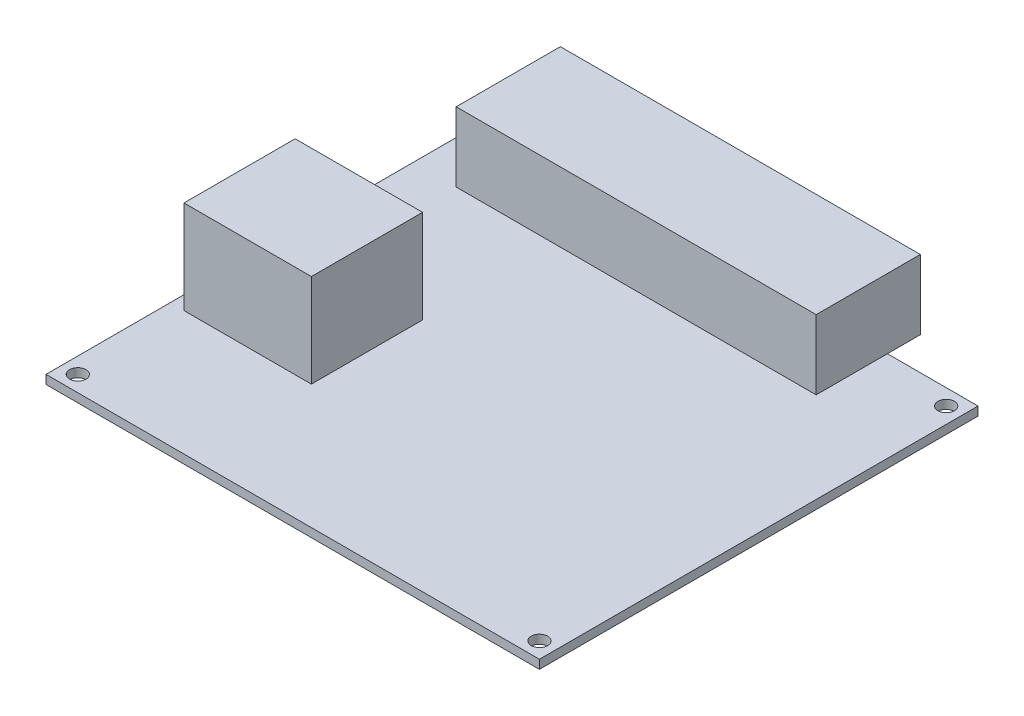
ISO-10303-21;
HEADER;
FILE_DESCRIPTION(('STEP AP214'),'2;1');
FILE_NAME('part.step','',(''),(''),'','','');
FILE_SCHEMA(('AUTOMOTIVE_DESIGN { 1 0 10303 214 1 1 1 1 }'));
ENDSEC;
DATA;
#1=APPLICATION_CONTEXT('core data for automotive mechanical design processes');
#2=APPLICATION_PROTOCOL_DEFINITION('international standard','automotive_design',2000,#1);
#3=PRODUCT_CONTEXT('',#1,'mechanical');
#4=PRODUCT('Part','Part','',(#3));
#5=PRODUCT_RELATED_PRODUCT_CATEGORY('part','',(#4));
#6=PRODUCT_DEFINITION_FORMATION('','',#4);
#7=PRODUCT_DEFINITION_CONTEXT('part definition',#1,'design');
#8=PRODUCT_DEFINITION('design','',#6,#7);
#9=PRODUCT_DEFINITION_SHAPE('','',#8);
#10=(LENGTH_UNIT() NAMED_UNIT(*) SI_UNIT(.MILLI.,.METRE.));
#11=(NAMED_UNIT(*) PLANE_ANGLE_UNIT() SI_UNIT($,.RADIAN.));
#12=(NAMED_UNIT(*) SI_UNIT($,.STERADIAN.) SOLID_ANGLE_UNIT());
#13=UNCERTAINTY_MEASURE_WITH_UNIT(LENGTH_MEASURE(1.E-05),#10,'distance_accuracy_value','');
#14=(GEOMETRIC_REPRESENTATION_CONTEXT(3) GLOBAL_UNCERTAINTY_ASSIGNED_CONTEXT((#13)) GLOBAL_UNIT_ASSIGNED_CONTEXT((#10,
#11,#12)) REPRESENTATION_CONTEXT('',''));
#15=CARTESIAN_POINT('',(0.,0.,0.));
#16=DIRECTION('',(0.,0.,1.));
#17=DIRECTION('',(1.,0.,0.));
#18=AXIS2_PLACEMENT_3D('',#15,#16,#17);
#19=CARTESIAN_POINT('',(0.,1.6,0.));
#20=DIRECTION('',(0.,-1.,0.));
#21=DIRECTION('',(0.,0.,-1.));
#22=AXIS2_PLACEMENT_3D('',#19,#20,#21);
#23=PLANE('',#22);
#24=DIRECTION('',(0.,0.,1.));
#25=VECTOR('',#24,1.);
#26=CARTESIAN_POINT('',(-37.18,1.6,-27.));
#27=LINE('',#26,#25);
#28=CARTESIAN_POINT('',(-37.18,1.6,-40.));
#29=VERTEX_POINT('',#28);
#30=CARTESIAN_POINT('',(-37.18,1.6,-27.));
#31=VERTEX_POINT('',#30);
#32=EDGE_CURVE('E11',#29,#31,#27,.T.);
#33=ORIENTED_EDGE('',*,*,#32,.F.);
#34=DIRECTION('',(-1.,0.,0.));
#35=VECTOR('',#34,1.);
#36=CARTESIAN_POINT('',(-45.,1.6,-40.));
#37=LINE('',#36,#35);
#38=CARTESIAN_POINT('',(-45.,1.6,-40.));
#39=VERTEX_POINT('',#38);
#40=EDGE_CURVE('E253',#29,#39,#37,.T.);
#41=ORIENTED_EDGE('',*,*,#40,.T.);
#42=DIRECTION('',(0.,0.,1.));
#43=VECTOR('',#42,1.);
#44=CARTESIAN_POINT('',(-45.,1.6,40.));
#45=LINE('',#44,#43);
#46=CARTESIAN_POINT('',(-45.,1.6,40.));
#47=VERTEX_POINT('',#46);
#48=EDGE_CURVE('E259',#39,#47,#45,.T.);
#49=ORIENTED_EDGE('',*,*,#48,.T.);
#50=DIRECTION('',(1.,0.,0.));
#51=VECTOR('',#50,1.);
#52=CARTESIAN_POINT('',(-45.,1.6,40.));
#53=LINE('',#52,#51);
#54=CARTESIAN_POINT('',(45.,1.6,40.));
#55=VERTEX_POINT('',#54);
#56=EDGE_CURVE('E263',#47,#55,#53,.T.);
#57=ORIENTED_EDGE('',*,*,#56,.T.);
#58=DIRECTION('',(0.,0.,-1.));
#59=VECTOR('',#58,1.);
#60=CARTESIAN_POINT('',(45.,1.6,40.));
#61=LINE('',#60,#59);
#62=CARTESIAN_POINT('',(45.,1.6,-40.));
#63=VERTEX_POINT('',#62);
#64=EDGE_CURVE('E249',#55,#63,#61,.T.);
#65=ORIENTED_EDGE('',*,*,#64,.T.);
#66=CARTESIAN_POINT('',(28.48,1.6,-40.));
#67=VERTEX_POINT('',#66);
#68=EDGE_CURVE('E255',#63,#67,#37,.T.);
#69=ORIENTED_EDGE('',*,*,#68,.T.);
#70=DIRECTION('',(0.,0.,-1.));
#71=VECTOR('',#70,1.);
#72=CARTESIAN_POINT('',(28.48,1.6,-46.));
#73=LINE('',#72,#71);
#74=CARTESIAN_POINT('',(28.48,1.6,-27.));
#75=VERTEX_POINT('',#74);
#76=EDGE_CURVE('E195',#75,#67,#73,.T.);
#77=ORIENTED_EDGE('',*,*,#76,.F.);
#78=DIRECTION('',(1.,0.,0.));
#79=VECTOR('',#78,1.);
#80=CARTESIAN_POINT('',(28.48,1.6,-27.));
#81=LINE('',#80,#79);
#82=EDGE_CURVE('E171',#31,#75,#81,.T.);
#83=ORIENTED_EDGE('',*,*,#82,.F.);
#84=EDGE_LOOP('',(#33,#41,#49,#57,#65,#69,#77,#83));
#85=FACE_BOUND('',#84,.T.);
#86=CARTESIAN_POINT('',(-42.1,1.6,-37.1));
#87=DIRECTION('',(0.,1.,0.));
#88=DIRECTION('',(0.,0.,1.));
#89=AXIS2_PLACEMENT_3D('',#86,#87,#88);
#90=CIRCLE('',#89,1.5);
#91=CARTESIAN_POINT('',(-42.1,1.6,-35.6));
#92=VERTEX_POINT('',#91);
#93=EDGE_CURVE('E241',#92,#92,#90,.T.);
#94=ORIENTED_EDGE('',*,*,#93,.F.);
#95=EDGE_LOOP('',(#94));
#96=FACE_BOUND('',#95,.T.);
#97=CARTESIAN_POINT('',(42.1,1.6,-37.1));
#98=DIRECTION('',(0.,1.,0.));
#99=DIRECTION('',(0.,0.,-1.));
#100=AXIS2_PLACEMENT_3D('',#97,#98,#99);
#101=CIRCLE('',#100,1.5);
#102=CARTESIAN_POINT('',(42.1,1.6,-38.6));
#103=VERTEX_POINT('',#102);
#104=EDGE_CURVE('E233',#103,#103,#101,.T.);
#105=ORIENTED_EDGE('',*,*,#104,.F.);
#106=EDGE_LOOP('',(#105));
#107=FACE_BOUND('',#106,.T.);
#108=CARTESIAN_POINT('',(-42.1,1.6,37.1));
#109=DIRECTION('',(0.,1.,0.));
#110=DIRECTION('',(0.,0.,-1.));
#111=AXIS2_PLACEMENT_3D('',#108,#109,#110);
#112=CIRCLE('',#111,1.5);
#113=CARTESIAN_POINT('',(-42.1,1.6,35.6));
#114=VERTEX_POINT('',#113);
#115=EDGE_CURVE('E225',#114,#114,#112,.T.);
#116=ORIENTED_EDGE('',*,*,#115,.F.);
#117=EDGE_LOOP('',(#116));
#118=FACE_BOUND('',#117,.T.);
#119=CARTESIAN_POINT('',(42.1,1.6,37.1));
#120=DIRECTION('',(0.,1.,0.));
#121=DIRECTION('',(0.,0.,1.));
#122=AXIS2_PLACEMENT_3D('',#119,#120,#121);
#123=CIRCLE('',#122,1.5);
#124=CARTESIAN_POINT('',(42.1,1.6,38.6));
#125=VERTEX_POINT('',#124);
#126=EDGE_CURVE('E217',#125,#125,#123,.T.);
#127=ORIENTED_EDGE('',*,*,#126,.F.);
#128=EDGE_LOOP('',(#127));
#129=FACE_BOUND('',#128,.T.);
#130=DIRECTION('',(0.,0.,-1.));
#131=VECTOR('',#130,1.);
#132=CARTESIAN_POINT('',(-19.2535187945024,1.6,17.3394270574598));
#133=LINE('',#132,#131);
#134=CARTESIAN_POINT('',(-19.2535187945024,1.6,17.3394270574598));
#135=VERTEX_POINT('',#134);
#136=CARTESIAN_POINT('',(-19.2535187945024,1.6,-2.93942705745984));
#137=VERTEX_POINT('',#136);
#138=EDGE_CURVE('E165',#135,#137,#133,.T.);
#139=ORIENTED_EDGE('',*,*,#138,.F.);
#140=DIRECTION('',(1.,0.,0.));
#141=VECTOR('',#140,1.);
#142=CARTESIAN_POINT('',(-42.494452723961,1.6,17.3394270574598));
#143=LINE('',#142,#141);
#144=CARTESIAN_POINT('',(-42.494452723961,1.6,17.3394270574598));
#145=VERTEX_POINT('',#144);
#146=EDGE_CURVE('E162',#145,#135,#143,.T.);
#147=ORIENTED_EDGE('',*,*,#146,.F.);
#148=DIRECTION('',(0.,0.,1.));
#149=VECTOR('',#148,1.);
#150=CARTESIAN_POINT('',(-42.494452723961,1.6,17.3394270574598));
#151=LINE('',#150,#149);
#152=CARTESIAN_POINT('',(-42.494452723961,1.6,-2.93942705745984));
#153=VERTEX_POINT('',#152);
#154=EDGE_CURVE('E68',#153,#145,#151,.T.);
#155=ORIENTED_EDGE('',*,*,#154,.F.);
#156=DIRECTION('',(-1.,0.,0.));
#157=VECTOR('',#156,1.);
#158=CARTESIAN_POINT('',(-42.494452723961,1.6,-2.93942705745984));
#159=LINE('',#158,#157);
#160=EDGE_CURVE('E63',#137,#153,#159,.T.);
#161=ORIENTED_EDGE('',*,*,#160,.F.);
#162=EDGE_LOOP('',(#139,#147,#155,#161));
#163=FACE_BOUND('',#162,.T.);
#164=ADVANCED_FACE('F45',(#85,#96,#107,#118,#129,#163),#23,.F.);
#165=CARTESIAN_POINT('',(0.,0.,0.));
#166=DIRECTION('',(0.,-1.,0.));
#167=DIRECTION('',(0.,0.,-1.));
#168=AXIS2_PLACEMENT_3D('',#165,#166,#167);
#169=PLANE('',#168);
#170=CARTESIAN_POINT('',(-42.1,0.,37.1));
#171=DIRECTION('',(0.,1.,0.));
#172=DIRECTION('',(0.,0.,-1.));
#173=AXIS2_PLACEMENT_3D('',#170,#171,#172);
#174=CIRCLE('',#173,1.5);
#175=CARTESIAN_POINT('',(-42.1,0.,35.6));
#176=VERTEX_POINT('',#175);
#177=EDGE_CURVE('E221',#176,#176,#174,.T.);
#178=ORIENTED_EDGE('',*,*,#177,.T.);
#179=EDGE_LOOP('',(#178));
#180=FACE_BOUND('',#179,.T.);
#181=CARTESIAN_POINT('',(-42.1,0.,-37.1));
#182=DIRECTION('',(0.,1.,0.));
#183=DIRECTION('',(0.,0.,1.));
#184=AXIS2_PLACEMENT_3D('',#181,#182,#183);
#185=CIRCLE('',#184,1.5);
#186=CARTESIAN_POINT('',(-42.1,0.,-35.6));
#187=VERTEX_POINT('',#186);
#188=EDGE_CURVE('E237',#187,#187,#185,.T.);
#189=ORIENTED_EDGE('',*,*,#188,.T.);
#190=EDGE_LOOP('',(#189));
#191=FACE_BOUND('',#190,.T.);
#192=DIRECTION('',(0.,0.,-1.));
#193=VECTOR('',#192,1.);
#194=CARTESIAN_POINT('',(45.,0.,40.));
#195=LINE('',#194,#193);
#196=CARTESIAN_POINT('',(45.,0.,40.));
#197=VERTEX_POINT('',#196);
#198=CARTESIAN_POINT('',(45.,0.,-40.));
#199=VERTEX_POINT('',#198);
#200=EDGE_CURVE('E245',#197,#199,#195,.T.);
#201=ORIENTED_EDGE('',*,*,#200,.F.);
#202=DIRECTION('',(1.,0.,0.));
#203=VECTOR('',#202,1.);
#204=CARTESIAN_POINT('',(-45.,0.,40.));
#205=LINE('',#204,#203);
#206=CARTESIAN_POINT('',(-45.,0.,40.));
#207=VERTEX_POINT('',#206);
#208=EDGE_CURVE('E254',#207,#197,#205,.T.);
#209=ORIENTED_EDGE('',*,*,#208,.F.);
#210=DIRECTION('',(0.,0.,1.));
#211=VECTOR('',#210,1.);
#212=CARTESIAN_POINT('',(-45.,0.,40.));
#213=LINE('',#212,#211);
#214=CARTESIAN_POINT('',(-45.,0.,-40.));
#215=VERTEX_POINT('',#214);
#216=EDGE_CURVE('E273',#215,#207,#213,.T.);
#217=ORIENTED_EDGE('',*,*,#216,.F.);
#218=DIRECTION('',(-1.,0.,0.));
#219=VECTOR('',#218,1.);
#220=CARTESIAN_POINT('',(-45.,0.,-40.));
#221=LINE('',#220,#219);
#222=EDGE_CURVE('E270',#199,#215,#221,.T.);
#223=ORIENTED_EDGE('',*,*,#222,.F.);
#224=EDGE_LOOP('',(#201,#209,#217,#223));
#225=FACE_BOUND('',#224,.T.);
#226=CARTESIAN_POINT('',(42.1,0.,-37.1));
#227=DIRECTION('',(0.,1.,0.));
#228=DIRECTION('',(0.,0.,-1.));
#229=AXIS2_PLACEMENT_3D('',#226,#227,#228);
#230=CIRCLE('',#229,1.5);
#231=CARTESIAN_POINT('',(42.1,0.,-38.6));
#232=VERTEX_POINT('',#231);
#233=EDGE_CURVE('E229',#232,#232,#230,.T.);
#234=ORIENTED_EDGE('',*,*,#233,.T.);
#235=EDGE_LOOP('',(#234));
#236=FACE_BOUND('',#235,.T.);
#237=CARTESIAN_POINT('',(42.1,0.,37.1));
#238=DIRECTION('',(0.,1.,0.));
#239=DIRECTION('',(0.,0.,1.));
#240=AXIS2_PLACEMENT_3D('',#237,#238,#239);
#241=CIRCLE('',#240,1.5);
#242=CARTESIAN_POINT('',(42.1,0.,38.6));
#243=VERTEX_POINT('',#242);
#244=EDGE_CURVE('E216',#243,#243,#241,.T.);
#245=ORIENTED_EDGE('',*,*,#244,.T.);
#246=EDGE_LOOP('',(#245));
#247=FACE_BOUND('',#246,.T.);
#248=ADVANCED_FACE('F302',(#180,#191,#225,#236,#247),#169,.T.);
#249=CARTESIAN_POINT('',(45.,1.6,40.));
#250=DIRECTION('',(-1.,0.,0.));
#251=DIRECTION('',(0.,0.,1.));
#252=AXIS2_PLACEMENT_3D('',#249,#250,#251);
#253=PLANE('',#252);
#254=ORIENTED_EDGE('',*,*,#200,.T.);
#255=DIRECTION('',(0.,-1.,0.));
#256=VECTOR('',#255,1.);
#257=CARTESIAN_POINT('',(45.,1.6,-40.));
#258=LINE('',#257,#256);
#259=EDGE_CURVE('E49',#63,#199,#258,.T.);
#260=ORIENTED_EDGE('',*,*,#259,.F.);
#261=ORIENTED_EDGE('',*,*,#64,.F.);
#262=DIRECTION('',(0.,-1.,0.));
#263=VECTOR('',#262,1.);
#264=CARTESIAN_POINT('',(45.,1.6,40.));
#265=LINE('',#264,#263);
#266=EDGE_CURVE('E266',#55,#197,#265,.T.);
#267=ORIENTED_EDGE('',*,*,#266,.T.);
#268=EDGE_LOOP('',(#254,#260,#261,#267));
#269=FACE_BOUND('',#268,.T.);
#270=ADVANCED_FACE('F47',(#269),#253,.F.);
#271=CARTESIAN_POINT('',(-45.,1.6,-40.));
#272=DIRECTION('',(0.,0.,1.));
#273=DIRECTION('',(1.,0.,0.));
#274=AXIS2_PLACEMENT_3D('',#271,#272,#273);
#275=PLANE('',#274);
#276=ORIENTED_EDGE('',*,*,#222,.T.);
#277=DIRECTION('',(0.,-1.,0.));
#278=VECTOR('',#277,1.);
#279=CARTESIAN_POINT('',(-45.,1.6,-40.));
#280=LINE('',#279,#278);
#281=EDGE_CURVE('E284',#39,#215,#280,.T.);
#282=ORIENTED_EDGE('',*,*,#281,.F.);
#283=ORIENTED_EDGE('',*,*,#40,.F.);
#284=EDGE_CURVE('E260',#67,#29,#37,.T.);
#285=ORIENTED_EDGE('',*,*,#284,.F.);
#286=ORIENTED_EDGE('',*,*,#68,.F.);
#287=ORIENTED_EDGE('',*,*,#259,.T.);
#288=EDGE_LOOP('',(#276,#282,#283,#285,#286,#287));
#289=FACE_BOUND('',#288,.T.);
#290=ADVANCED_FACE('F295',(#289),#275,.F.);
#291=CARTESIAN_POINT('',(-45.,1.6,40.));
#292=DIRECTION('',(1.,0.,0.));
#293=DIRECTION('',(0.,0.,-1.));
#294=AXIS2_PLACEMENT_3D('',#291,#292,#293);
#295=PLANE('',#294);
#296=ORIENTED_EDGE('',*,*,#216,.T.);
#297=DIRECTION('',(0.,-1.,0.));
#298=VECTOR('',#297,1.);
#299=CARTESIAN_POINT('',(-45.,1.6,40.));
#300=LINE('',#299,#298);
#301=EDGE_CURVE('E281',#47,#207,#300,.T.);
#302=ORIENTED_EDGE('',*,*,#301,.F.);
#303=ORIENTED_EDGE('',*,*,#48,.F.);
#304=ORIENTED_EDGE('',*,*,#281,.T.);
#305=EDGE_LOOP('',(#296,#302,#303,#304));
#306=FACE_BOUND('',#305,.T.);
#307=ADVANCED_FACE('F305',(#306),#295,.F.);
#308=CARTESIAN_POINT('',(-45.,1.6,40.));
#309=DIRECTION('',(0.,0.,-1.));
#310=DIRECTION('',(-1.,0.,0.));
#311=AXIS2_PLACEMENT_3D('',#308,#309,#310);
#312=PLANE('',#311);
#313=ORIENTED_EDGE('',*,*,#208,.T.);
#314=ORIENTED_EDGE('',*,*,#266,.F.);
#315=ORIENTED_EDGE('',*,*,#56,.F.);
#316=ORIENTED_EDGE('',*,*,#301,.T.);
#317=EDGE_LOOP('',(#313,#314,#315,#316));
#318=FACE_BOUND('',#317,.T.);
#319=ADVANCED_FACE('F308',(#318),#312,.F.);
#320=CARTESIAN_POINT('',(-42.1,1.6,-37.1));
#321=DIRECTION('',(0.,-1.,0.));
#322=DIRECTION('',(0.,0.,-1.));
#323=AXIS2_PLACEMENT_3D('',#320,#321,#322);
#324=CYLINDRICAL_SURFACE('',#323,1.5);
#325=ORIENTED_EDGE('',*,*,#93,.T.);
#326=EDGE_LOOP('',(#325));
#327=FACE_BOUND('',#326,.T.);
#328=ORIENTED_EDGE('',*,*,#188,.F.);
#329=EDGE_LOOP('',(#328));
#330=FACE_BOUND('',#329,.T.);
#331=ADVANCED_FACE('F356',(#327,#330),#324,.F.);
#332=CARTESIAN_POINT('',(42.1,1.6,-37.1));
#333=DIRECTION('',(0.,-1.,0.));
#334=DIRECTION('',(0.,0.,-1.));
#335=AXIS2_PLACEMENT_3D('',#332,#333,#334);
#336=CYLINDRICAL_SURFACE('',#335,1.5);
#337=ORIENTED_EDGE('',*,*,#104,.T.);
#338=EDGE_LOOP('',(#337));
#339=FACE_BOUND('',#338,.T.);
#340=ORIENTED_EDGE('',*,*,#233,.F.);
#341=EDGE_LOOP('',(#340));
#342=FACE_BOUND('',#341,.T.);
#343=ADVANCED_FACE('F389',(#339,#342),#336,.F.);
#344=CARTESIAN_POINT('',(-42.1,1.6,37.1));
#345=DIRECTION('',(0.,-1.,0.));
#346=DIRECTION('',(0.,0.,-1.));
#347=AXIS2_PLACEMENT_3D('',#344,#345,#346);
#348=CYLINDRICAL_SURFACE('',#347,1.5);
#349=ORIENTED_EDGE('',*,*,#115,.T.);
#350=EDGE_LOOP('',(#349));
#351=FACE_BOUND('',#350,.T.);
#352=ORIENTED_EDGE('',*,*,#177,.F.);
#353=EDGE_LOOP('',(#352));
#354=FACE_BOUND('',#353,.T.);
#355=ADVANCED_FACE('F397',(#351,#354),#348,.F.);
#356=CARTESIAN_POINT('',(42.1,1.6,37.1));
#357=DIRECTION('',(0.,-1.,0.));
#358=DIRECTION('',(0.,0.,-1.));
#359=AXIS2_PLACEMENT_3D('',#356,#357,#358);
#360=CYLINDRICAL_SURFACE('',#359,1.5);
#361=ORIENTED_EDGE('',*,*,#126,.T.);
#362=EDGE_LOOP('',(#361));
#363=FACE_BOUND('',#362,.T.);
#364=ORIENTED_EDGE('',*,*,#244,.F.);
#365=EDGE_LOOP('',(#364));
#366=FACE_BOUND('',#365,.T.);
#367=ADVANCED_FACE('F404',(#363,#366),#360,.F.);
#368=CARTESIAN_POINT('',(-37.18,14.28,-27.));
#369=DIRECTION('',(1.,0.,0.));
#370=DIRECTION('',(0.,0.,-1.));
#371=AXIS2_PLACEMENT_3D('',#368,#369,#370);
#372=PLANE('',#371);
#373=CARTESIAN_POINT('',(-37.18,1.6,-46.));
#374=VERTEX_POINT('',#373);
#375=EDGE_CURVE('E56',#374,#29,#27,.T.);
#376=ORIENTED_EDGE('',*,*,#375,.T.);
#377=ORIENTED_EDGE('',*,*,#32,.T.);
#378=DIRECTION('',(0.,-1.,0.));
#379=VECTOR('',#378,1.);
#380=CARTESIAN_POINT('',(-37.18,14.28,-27.));
#381=LINE('',#380,#379);
#382=CARTESIAN_POINT('',(-37.18,14.28,-27.));
#383=VERTEX_POINT('',#382);
#384=EDGE_CURVE('E212',#383,#31,#381,.T.);
#385=ORIENTED_EDGE('',*,*,#384,.F.);
#386=DIRECTION('',(0.,0.,1.));
#387=VECTOR('',#386,1.);
#388=CARTESIAN_POINT('',(-37.18,14.28,-27.));
#389=LINE('',#388,#387);
#390=CARTESIAN_POINT('',(-37.18,14.28,-46.));
#391=VERTEX_POINT('',#390);
#392=EDGE_CURVE('E176',#391,#383,#389,.T.);
#393=ORIENTED_EDGE('',*,*,#392,.F.);
#394=DIRECTION('',(0.,-1.,0.));
#395=VECTOR('',#394,1.);
#396=CARTESIAN_POINT('',(-37.18,14.28,-46.));
#397=LINE('',#396,#395);
#398=EDGE_CURVE('E189',#391,#374,#397,.T.);
#399=ORIENTED_EDGE('',*,*,#398,.T.);
#400=EDGE_LOOP('',(#376,#377,#385,#393,#399));
#401=FACE_BOUND('',#400,.T.);
#402=ADVANCED_FACE('F321',(#401),#372,.F.);
#403=CARTESIAN_POINT('',(28.48,14.28,-27.));
#404=DIRECTION('',(0.,0.,-1.));
#405=DIRECTION('',(-1.,0.,0.));
#406=AXIS2_PLACEMENT_3D('',#403,#404,#405);
#407=PLANE('',#406);
#408=ORIENTED_EDGE('',*,*,#82,.T.);
#409=DIRECTION('',(0.,-1.,0.));
#410=VECTOR('',#409,1.);
#411=CARTESIAN_POINT('',(28.48,14.28,-27.));
#412=LINE('',#411,#410);
#413=CARTESIAN_POINT('',(28.48,14.28,-27.));
#414=VERTEX_POINT('',#413);
#415=EDGE_CURVE('E208',#414,#75,#412,.T.);
#416=ORIENTED_EDGE('',*,*,#415,.F.);
#417=DIRECTION('',(1.,0.,0.));
#418=VECTOR('',#417,1.);
#419=CARTESIAN_POINT('',(28.48,14.28,-27.));
#420=LINE('',#419,#418);
#421=EDGE_CURVE('E180',#383,#414,#420,.T.);
#422=ORIENTED_EDGE('',*,*,#421,.F.);
#423=ORIENTED_EDGE('',*,*,#384,.T.);
#424=EDGE_LOOP('',(#408,#416,#422,#423));
#425=FACE_BOUND('',#424,.T.);
#426=ADVANCED_FACE('F335',(#425),#407,.F.);
#427=CARTESIAN_POINT('',(28.48,14.28,-46.));
#428=DIRECTION('',(-1.,0.,0.));
#429=DIRECTION('',(0.,0.,1.));
#430=AXIS2_PLACEMENT_3D('',#427,#428,#429);
#431=PLANE('',#430);
#432=ORIENTED_EDGE('',*,*,#76,.T.);
#433=CARTESIAN_POINT('',(28.48,1.6,-46.));
#434=VERTEX_POINT('',#433);
#435=EDGE_CURVE('E194',#67,#434,#73,.T.);
#436=ORIENTED_EDGE('',*,*,#435,.T.);
#437=DIRECTION('',(0.,-1.,0.));
#438=VECTOR('',#437,1.);
#439=CARTESIAN_POINT('',(28.48,14.28,-46.));
#440=LINE('',#439,#438);
#441=CARTESIAN_POINT('',(28.48,14.28,-46.));
#442=VERTEX_POINT('',#441);
#443=EDGE_CURVE('E204',#442,#434,#440,.T.);
#444=ORIENTED_EDGE('',*,*,#443,.F.);
#445=DIRECTION('',(0.,0.,-1.));
#446=VECTOR('',#445,1.);
#447=CARTESIAN_POINT('',(28.48,14.28,-46.));
#448=LINE('',#447,#446);
#449=EDGE_CURVE('E184',#414,#442,#448,.T.);
#450=ORIENTED_EDGE('',*,*,#449,.F.);
#451=ORIENTED_EDGE('',*,*,#415,.T.);
#452=EDGE_LOOP('',(#432,#436,#444,#450,#451));
#453=FACE_BOUND('',#452,.T.);
#454=ADVANCED_FACE('F331',(#453),#431,.F.);
#455=CARTESIAN_POINT('',(-37.18,14.28,-46.));
#456=DIRECTION('',(0.,0.,1.));
#457=DIRECTION('',(1.,0.,0.));
#458=AXIS2_PLACEMENT_3D('',#455,#456,#457);
#459=PLANE('',#458);
#460=DIRECTION('',(-1.,0.,0.));
#461=VECTOR('',#460,1.);
#462=CARTESIAN_POINT('',(-37.18,1.6,-46.));
#463=LINE('',#462,#461);
#464=EDGE_CURVE('E181',#434,#374,#463,.T.);
#465=ORIENTED_EDGE('',*,*,#464,.T.);
#466=ORIENTED_EDGE('',*,*,#398,.F.);
#467=DIRECTION('',(-1.,0.,0.));
#468=VECTOR('',#467,1.);
#469=CARTESIAN_POINT('',(-37.18,14.28,-46.));
#470=LINE('',#469,#468);
#471=EDGE_CURVE('E187',#442,#391,#470,.T.);
#472=ORIENTED_EDGE('',*,*,#471,.F.);
#473=ORIENTED_EDGE('',*,*,#443,.T.);
#474=EDGE_LOOP('',(#465,#466,#472,#473));
#475=FACE_BOUND('',#474,.T.);
#476=ADVANCED_FACE('F327',(#475),#459,.F.);
#477=CARTESIAN_POINT('',(0.,14.28,0.));
#478=DIRECTION('',(0.,-1.,0.));
#479=DIRECTION('',(0.,0.,-1.));
#480=AXIS2_PLACEMENT_3D('',#477,#478,#479);
#481=PLANE('',#480);
#482=ORIENTED_EDGE('',*,*,#392,.T.);
#483=ORIENTED_EDGE('',*,*,#421,.T.);
#484=ORIENTED_EDGE('',*,*,#449,.T.);
#485=ORIENTED_EDGE('',*,*,#471,.T.);
#486=EDGE_LOOP('',(#482,#483,#484,#485));
#487=FACE_BOUND('',#486,.T.);
#488=ADVANCED_FACE('F337',(#487),#481,.F.);
#489=CARTESIAN_POINT('',(0.,1.6,0.));
#490=DIRECTION('',(0.,-1.,0.));
#491=DIRECTION('',(0.,0.,-1.));
#492=AXIS2_PLACEMENT_3D('',#489,#490,#491);
#493=PLANE('',#492);
#494=ORIENTED_EDGE('',*,*,#435,.F.);
#495=ORIENTED_EDGE('',*,*,#284,.T.);
#496=ORIENTED_EDGE('',*,*,#375,.F.);
#497=ORIENTED_EDGE('',*,*,#464,.F.);
#498=EDGE_LOOP('',(#494,#495,#496,#497));
#499=FACE_BOUND('',#498,.T.);
#500=ADVANCED_FACE('F318',(#499),#493,.T.);
#501=CARTESIAN_POINT('',(-19.2535187945024,18.6,17.3394270574598));
#502=DIRECTION('',(-1.,0.,0.));
#503=DIRECTION('',(0.,0.,1.));
#504=AXIS2_PLACEMENT_3D('',#501,#502,#503);
#505=PLANE('',#504);
#506=ORIENTED_EDGE('',*,*,#138,.T.);
#507=DIRECTION('',(0.,-1.,0.));
#508=VECTOR('',#507,1.);
#509=CARTESIAN_POINT('',(-19.2535187945024,18.6,-2.93942705745984));
#510=LINE('',#509,#508);
#511=CARTESIAN_POINT('',(-19.2535187945024,18.6,-2.93942705745984));
#512=VERTEX_POINT('',#511);
#513=EDGE_CURVE('E144',#512,#137,#510,.T.);
#514=ORIENTED_EDGE('',*,*,#513,.F.);
#515=DIRECTION('',(0.,0.,-1.));
#516=VECTOR('',#515,1.);
#517=CARTESIAN_POINT('',(-19.2535187945024,18.6,17.3394270574598));
#518=LINE('',#517,#516);
#519=CARTESIAN_POINT('',(-19.2535187945024,18.6,17.3394270574598));
#520=VERTEX_POINT('',#519);
#521=EDGE_CURVE('E152',#520,#512,#518,.T.);
#522=ORIENTED_EDGE('',*,*,#521,.F.);
#523=DIRECTION('',(0.,-1.,0.));
#524=VECTOR('',#523,1.);
#525=CARTESIAN_POINT('',(-19.2535187945024,18.6,17.3394270574598));
#526=LINE('',#525,#524);
#527=EDGE_CURVE('E505',#520,#135,#526,.T.);
#528=ORIENTED_EDGE('',*,*,#527,.T.);
#529=EDGE_LOOP('',(#506,#514,#522,#528));
#530=FACE_BOUND('',#529,.T.);
#531=ADVANCED_FACE('F164',(#530),#505,.F.);
#532=CARTESIAN_POINT('',(-42.494452723961,18.6,-2.93942705745984));
#533=DIRECTION('',(0.,0.,1.));
#534=DIRECTION('',(1.,0.,0.));
#535=AXIS2_PLACEMENT_3D('',#532,#533,#534);
#536=PLANE('',#535);
#537=ORIENTED_EDGE('',*,*,#160,.T.);
#538=DIRECTION('',(0.,-1.,0.));
#539=VECTOR('',#538,1.);
#540=CARTESIAN_POINT('',(-42.494452723961,18.6,-2.93942705745984));
#541=LINE('',#540,#539);
#542=CARTESIAN_POINT('',(-42.494452723961,18.6,-2.93942705745984));
#543=VERTEX_POINT('',#542);
#544=EDGE_CURVE('E147',#543,#153,#541,.T.);
#545=ORIENTED_EDGE('',*,*,#544,.F.);
#546=DIRECTION('',(-1.,0.,0.));
#547=VECTOR('',#546,1.);
#548=CARTESIAN_POINT('',(-42.494452723961,18.6,-2.93942705745984));
#549=LINE('',#548,#547);
#550=EDGE_CURVE('E140',#512,#543,#549,.T.);
#551=ORIENTED_EDGE('',*,*,#550,.F.);
#552=ORIENTED_EDGE('',*,*,#513,.T.);
#553=EDGE_LOOP('',(#537,#545,#551,#552));
#554=FACE_BOUND('',#553,.T.);
#555=ADVANCED_FACE('F142',(#554),#536,.F.);
#556=CARTESIAN_POINT('',(-42.494452723961,18.6,17.3394270574598));
#557=DIRECTION('',(1.,0.,0.));
#558=DIRECTION('',(0.,0.,-1.));
#559=AXIS2_PLACEMENT_3D('',#556,#557,#558);
#560=PLANE('',#559);
#561=ORIENTED_EDGE('',*,*,#154,.T.);
#562=DIRECTION('',(0.,-1.,0.));
#563=VECTOR('',#562,1.);
#564=CARTESIAN_POINT('',(-42.494452723961,18.6,17.3394270574598));
#565=LINE('',#564,#563);
#566=CARTESIAN_POINT('',(-42.494452723961,18.6,17.3394270574598));
#567=VERTEX_POINT('',#566);
#568=EDGE_CURVE('E172',#567,#145,#565,.T.);
#569=ORIENTED_EDGE('',*,*,#568,.F.);
#570=DIRECTION('',(0.,0.,1.));
#571=VECTOR('',#570,1.);
#572=CARTESIAN_POINT('',(-42.494452723961,18.6,17.3394270574598));
#573=LINE('',#572,#571);
#574=EDGE_CURVE('E151',#543,#567,#573,.T.);
#575=ORIENTED_EDGE('',*,*,#574,.F.);
#576=ORIENTED_EDGE('',*,*,#544,.T.);
#577=EDGE_LOOP('',(#561,#569,#575,#576));
#578=FACE_BOUND('',#577,.T.);
#579=ADVANCED_FACE('F473',(#578),#560,.F.);
#580=CARTESIAN_POINT('',(-42.494452723961,18.6,17.3394270574598));
#581=DIRECTION('',(0.,0.,-1.));
#582=DIRECTION('',(-1.,0.,0.));
#583=AXIS2_PLACEMENT_3D('',#580,#581,#582);
#584=PLANE('',#583);
#585=ORIENTED_EDGE('',*,*,#146,.T.);
#586=ORIENTED_EDGE('',*,*,#527,.F.);
#587=DIRECTION('',(1.,0.,0.));
#588=VECTOR('',#587,1.);
#589=CARTESIAN_POINT('',(-42.494452723961,18.6,17.3394270574598));
#590=LINE('',#589,#588);
#591=EDGE_CURVE('E157',#567,#520,#590,.T.);
#592=ORIENTED_EDGE('',*,*,#591,.F.);
#593=ORIENTED_EDGE('',*,*,#568,.T.);
#594=EDGE_LOOP('',(#585,#586,#592,#593));
#595=FACE_BOUND('',#594,.T.);
#596=ADVANCED_FACE('F482',(#595),#584,.F.);
#597=CARTESIAN_POINT('',(0.,18.6,0.));
#598=DIRECTION('',(0.,-1.,0.));
#599=DIRECTION('',(0.,0.,-1.));
#600=AXIS2_PLACEMENT_3D('',#597,#598,#599);
#601=PLANE('',#600);
#602=ORIENTED_EDGE('',*,*,#521,.T.);
#603=ORIENTED_EDGE('',*,*,#550,.T.);
#604=ORIENTED_EDGE('',*,*,#574,.T.);
#605=ORIENTED_EDGE('',*,*,#591,.T.);
#606=EDGE_LOOP('',(#602,#603,#604,#605));
#607=FACE_BOUND('',#606,.T.);
#608=ADVANCED_FACE('F155',(#607),#601,.F.);
#609=CLOSED_SHELL('',(#164,#248,#270,#290,#307,#319,#331,#343,#355,#367,#402,#426,#454,#476,
#488,#500,#531,#555,#579,#596,#608));
#610=MANIFOLD_SOLID_BREP('B2',#609);
#611=ADVANCED_BREP_SHAPE_REPRESENTATION('',(#18,#610),#14);
#612=SHAPE_DEFINITION_REPRESENTATION(#9,#611);
ENDSEC;
END-ISO-10303-21;
